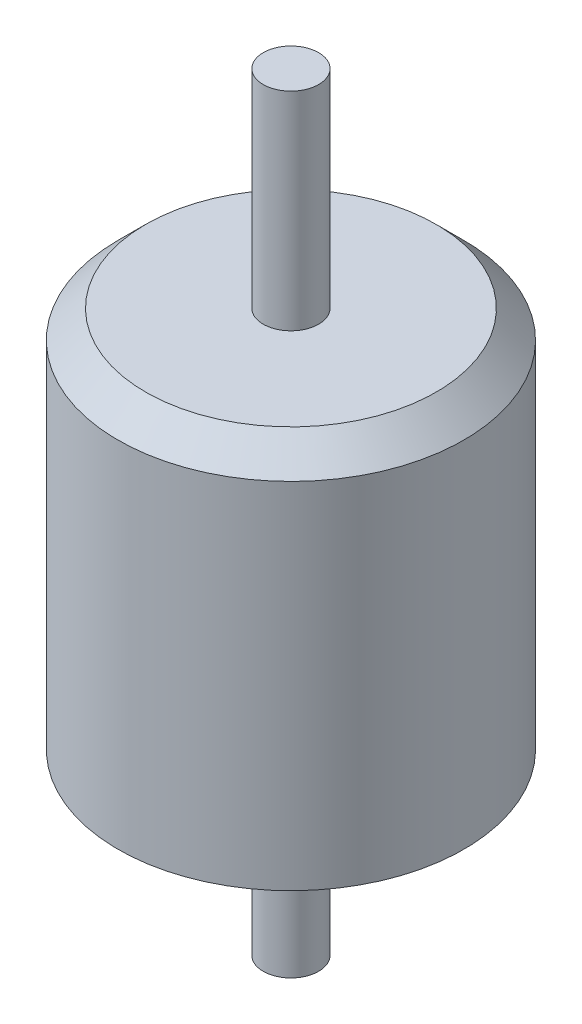
ISO-10303-21;
HEADER;
FILE_DESCRIPTION(('STEP AP214'),'2;1');
FILE_NAME('part.step','',(''),(''),'','','');
FILE_SCHEMA(('AUTOMOTIVE_DESIGN { 1 0 10303 214 1 1 1 1 }'));
ENDSEC;
DATA;
#1=APPLICATION_CONTEXT('core data for automotive mechanical design processes');
#2=APPLICATION_PROTOCOL_DEFINITION('international standard','automotive_design',2000,#1);
#3=PRODUCT_CONTEXT('',#1,'mechanical');
#4=PRODUCT('Part','Part','',(#3));
#5=PRODUCT_RELATED_PRODUCT_CATEGORY('part','',(#4));
#6=PRODUCT_DEFINITION_FORMATION('','',#4);
#7=PRODUCT_DEFINITION_CONTEXT('part definition',#1,'design');
#8=PRODUCT_DEFINITION('design','',#6,#7);
#9=PRODUCT_DEFINITION_SHAPE('','',#8);
#10=(LENGTH_UNIT() NAMED_UNIT(*) SI_UNIT(.MILLI.,.METRE.));
#11=(NAMED_UNIT(*) PLANE_ANGLE_UNIT() SI_UNIT($,.RADIAN.));
#12=(NAMED_UNIT(*) SI_UNIT($,.STERADIAN.) SOLID_ANGLE_UNIT());
#13=UNCERTAINTY_MEASURE_WITH_UNIT(LENGTH_MEASURE(1.E-05),#10,'distance_accuracy_value','');
#14=(GEOMETRIC_REPRESENTATION_CONTEXT(3) GLOBAL_UNCERTAINTY_ASSIGNED_CONTEXT((#13)) GLOBAL_UNIT_ASSIGNED_CONTEXT((#10,
#11,#12)) REPRESENTATION_CONTEXT('',''));
#15=CARTESIAN_POINT('',(0.,0.,0.));
#16=DIRECTION('',(0.,0.,1.));
#17=DIRECTION('',(1.,0.,0.));
#18=AXIS2_PLACEMENT_3D('',#15,#16,#17);
#19=CARTESIAN_POINT('',(0.,0.,0.));
#20=DIRECTION('',(0.,1.,0.));
#21=DIRECTION('',(-1.,0.,0.));
#22=AXIS2_PLACEMENT_3D('',#19,#20,#21);
#23=PLANE('',#22);
#24=CARTESIAN_POINT('',(0.,0.,0.));
#25=DIRECTION('',(0.,1.,0.));
#26=DIRECTION('',(-1.,0.,0.));
#27=AXIS2_PLACEMENT_3D('',#24,#25,#26);
#28=CIRCLE('',#27,4.00000000000001);
#29=CARTESIAN_POINT('',(-4.00000000000001,0.,0.));
#30=VERTEX_POINT('',#29);
#31=EDGE_CURVE('E10',#30,#30,#28,.T.);
#32=ORIENTED_EDGE('',*,*,#31,.F.);
#33=EDGE_LOOP('',(#32));
#34=FACE_BOUND('',#33,.T.);
#35=ADVANCED_FACE('F31',(#34),#23,.F.);
#36=CARTESIAN_POINT('',(0.,111.,0.));
#37=DIRECTION('',(0.,1.,0.));
#38=DIRECTION('',(-1.,0.,0.));
#39=AXIS2_PLACEMENT_3D('',#36,#37,#38);
#40=CYLINDRICAL_SURFACE('',#39,4.00000000000001);
#41=CARTESIAN_POINT('',(0.,16.,0.));
#42=DIRECTION('',(0.,1.,0.));
#43=DIRECTION('',(-1.,0.,0.));
#44=AXIS2_PLACEMENT_3D('',#41,#42,#43);
#45=CIRCLE('',#44,4.00000000000001);
#46=CARTESIAN_POINT('',(-4.00000000000001,16.,0.));
#47=VERTEX_POINT('',#46);
#48=EDGE_CURVE('E37',#47,#47,#45,.T.);
#49=ORIENTED_EDGE('',*,*,#48,.F.);
#50=EDGE_LOOP('',(#49));
#51=FACE_BOUND('',#50,.T.);
#52=ORIENTED_EDGE('',*,*,#31,.T.);
#53=EDGE_LOOP('',(#52));
#54=FACE_BOUND('',#53,.T.);
#55=ADVANCED_FACE('F115',(#51,#54),#40,.T.);
#56=CARTESIAN_POINT('',(4.00000000000001,16.,0.));
#57=DIRECTION('',(0.,1.,0.));
#58=DIRECTION('',(-1.,0.,0.));
#59=AXIS2_PLACEMENT_3D('',#56,#57,#58);
#60=PLANE('',#59);
#61=CARTESIAN_POINT('',(0.,16.,0.));
#62=DIRECTION('',(0.,1.,0.));
#63=DIRECTION('',(-1.,0.,0.));
#64=AXIS2_PLACEMENT_3D('',#61,#62,#63);
#65=CIRCLE('',#64,7.00000000000001);
#66=CARTESIAN_POINT('',(-7.00000000000001,16.,0.));
#67=VERTEX_POINT('',#66);
#68=EDGE_CURVE('E41',#67,#67,#65,.T.);
#69=ORIENTED_EDGE('',*,*,#68,.F.);
#70=EDGE_LOOP('',(#69));
#71=FACE_BOUND('',#70,.T.);
#72=ORIENTED_EDGE('',*,*,#48,.T.);
#73=EDGE_LOOP('',(#72));
#74=FACE_BOUND('',#73,.T.);
#75=ADVANCED_FACE('F110',(#71,#74),#60,.F.);
#76=CARTESIAN_POINT('',(0.,111.,0.));
#77=DIRECTION('',(0.,1.,0.));
#78=DIRECTION('',(-1.,0.,0.));
#79=AXIS2_PLACEMENT_3D('',#76,#77,#78);
#80=CYLINDRICAL_SURFACE('',#79,7.00000000000001);
#81=CARTESIAN_POINT('',(0.,20.,0.));
#82=DIRECTION('',(0.,1.,0.));
#83=DIRECTION('',(-1.,0.,0.));
#84=AXIS2_PLACEMENT_3D('',#81,#82,#83);
#85=CIRCLE('',#84,7.00000000000001);
#86=CARTESIAN_POINT('',(-7.00000000000001,20.,0.));
#87=VERTEX_POINT('',#86);
#88=EDGE_CURVE('E45',#87,#87,#85,.T.);
#89=ORIENTED_EDGE('',*,*,#88,.F.);
#90=EDGE_LOOP('',(#89));
#91=FACE_BOUND('',#90,.T.);
#92=ORIENTED_EDGE('',*,*,#68,.T.);
#93=EDGE_LOOP('',(#92));
#94=FACE_BOUND('',#93,.T.);
#95=ADVANCED_FACE('F104',(#91,#94),#80,.T.);
#96=CARTESIAN_POINT('',(7.00000000000001,20.,0.));
#97=DIRECTION('',(0.,1.,0.));
#98=DIRECTION('',(-1.,0.,0.));
#99=AXIS2_PLACEMENT_3D('',#96,#97,#98);
#100=PLANE('',#99);
#101=CARTESIAN_POINT('',(0.,20.,0.));
#102=DIRECTION('',(0.,1.,0.));
#103=DIRECTION('',(-1.,0.,0.));
#104=AXIS2_PLACEMENT_3D('',#101,#102,#103);
#105=CIRCLE('',#104,15.);
#106=CARTESIAN_POINT('',(-15.,20.,0.));
#107=VERTEX_POINT('',#106);
#108=EDGE_CURVE('E50',#107,#107,#105,.T.);
#109=ORIENTED_EDGE('',*,*,#108,.F.);
#110=EDGE_LOOP('',(#109));
#111=FACE_BOUND('',#110,.T.);
#112=ORIENTED_EDGE('',*,*,#88,.T.);
#113=EDGE_LOOP('',(#112));
#114=FACE_BOUND('',#113,.T.);
#115=ADVANCED_FACE('F98',(#111,#114),#100,.F.);
#116=CARTESIAN_POINT('',(0.,20.,0.));
#117=DIRECTION('',(0.,1.,0.));
#118=DIRECTION('',(-1.,0.,0.));
#119=AXIS2_PLACEMENT_3D('',#116,#117,#118);
#120=CONICAL_SURFACE('',#119,15.,1.0471975511966);
#121=CARTESIAN_POINT('',(0.,25.7735026918963,0.));
#122=DIRECTION('',(0.,1.,0.));
#123=DIRECTION('',(-1.,0.,0.));
#124=AXIS2_PLACEMENT_3D('',#121,#122,#123);
#125=CIRCLE('',#124,25.);
#126=CARTESIAN_POINT('',(-25.,25.7735026918963,0.));
#127=VERTEX_POINT('',#126);
#128=EDGE_CURVE('E53',#127,#127,#125,.T.);
#129=ORIENTED_EDGE('',*,*,#128,.F.);
#130=EDGE_LOOP('',(#129));
#131=FACE_BOUND('',#130,.T.);
#132=ORIENTED_EDGE('',*,*,#108,.T.);
#133=EDGE_LOOP('',(#132));
#134=FACE_BOUND('',#133,.T.);
#135=ADVANCED_FACE('F92',(#131,#134),#120,.T.);
#136=CARTESIAN_POINT('',(0.,111.,0.));
#137=DIRECTION('',(0.,1.,0.));
#138=DIRECTION('',(-1.,0.,0.));
#139=AXIS2_PLACEMENT_3D('',#136,#137,#138);
#140=CYLINDRICAL_SURFACE('',#139,25.);
#141=CARTESIAN_POINT('',(0.,77.,0.));
#142=DIRECTION('',(0.,1.,0.));
#143=DIRECTION('',(-1.,0.,0.));
#144=AXIS2_PLACEMENT_3D('',#141,#142,#143);
#145=CIRCLE('',#144,25.);
#146=CARTESIAN_POINT('',(-25.,77.,0.));
#147=VERTEX_POINT('',#146);
#148=EDGE_CURVE('E56',#147,#147,#145,.T.);
#149=ORIENTED_EDGE('',*,*,#148,.F.);
#150=EDGE_LOOP('',(#149));
#151=FACE_BOUND('',#150,.T.);
#152=ORIENTED_EDGE('',*,*,#128,.T.);
#153=EDGE_LOOP('',(#152));
#154=FACE_BOUND('',#153,.T.);
#155=ADVANCED_FACE('F86',(#151,#154),#140,.T.);
#156=CARTESIAN_POINT('',(0.,77.,0.));
#157=DIRECTION('',(0.,-1.,0.));
#158=DIRECTION('',(1.,0.,0.));
#159=AXIS2_PLACEMENT_3D('',#156,#157,#158);
#160=CONICAL_SURFACE('',#159,25.,0.785398163397447);
#161=CARTESIAN_POINT('',(0.,81.,0.));
#162=DIRECTION('',(0.,1.,0.));
#163=DIRECTION('',(-1.,0.,0.));
#164=AXIS2_PLACEMENT_3D('',#161,#162,#163);
#165=CIRCLE('',#164,21.);
#166=CARTESIAN_POINT('',(-21.,81.,0.));
#167=VERTEX_POINT('',#166);
#168=EDGE_CURVE('E59',#167,#167,#165,.T.);
#169=ORIENTED_EDGE('',*,*,#168,.F.);
#170=EDGE_LOOP('',(#169));
#171=FACE_BOUND('',#170,.T.);
#172=ORIENTED_EDGE('',*,*,#148,.T.);
#173=EDGE_LOOP('',(#172));
#174=FACE_BOUND('',#173,.T.);
#175=ADVANCED_FACE('F80',(#171,#174),#160,.T.);
#176=CARTESIAN_POINT('',(21.,81.,0.));
#177=DIRECTION('',(0.,-1.,0.));
#178=DIRECTION('',(1.,0.,0.));
#179=AXIS2_PLACEMENT_3D('',#176,#177,#178);
#180=PLANE('',#179);
#181=CARTESIAN_POINT('',(0.,81.,0.));
#182=DIRECTION('',(0.,1.,0.));
#183=DIRECTION('',(-1.,0.,0.));
#184=AXIS2_PLACEMENT_3D('',#181,#182,#183);
#185=CIRCLE('',#184,4.);
#186=CARTESIAN_POINT('',(-4.00000000000001,81.,0.));
#187=VERTEX_POINT('',#186);
#188=EDGE_CURVE('E62',#187,#187,#185,.T.);
#189=ORIENTED_EDGE('',*,*,#188,.F.);
#190=EDGE_LOOP('',(#189));
#191=FACE_BOUND('',#190,.T.);
#192=ORIENTED_EDGE('',*,*,#168,.T.);
#193=EDGE_LOOP('',(#192));
#194=FACE_BOUND('',#193,.T.);
#195=ADVANCED_FACE('F74',(#191,#194),#180,.F.);
#196=CARTESIAN_POINT('',(0.,111.,0.));
#197=DIRECTION('',(0.,1.,0.));
#198=DIRECTION('',(-1.,0.,0.));
#199=AXIS2_PLACEMENT_3D('',#196,#197,#198);
#200=CYLINDRICAL_SURFACE('',#199,4.00000000000001);
#201=CARTESIAN_POINT('',(0.,111.,0.));
#202=DIRECTION('',(0.,1.,0.));
#203=DIRECTION('',(-1.,0.,0.));
#204=AXIS2_PLACEMENT_3D('',#201,#202,#203);
#205=CIRCLE('',#204,4.00000000000001);
#206=CARTESIAN_POINT('',(-4.00000000000001,111.,0.));
#207=VERTEX_POINT('',#206);
#208=EDGE_CURVE('E65',#207,#207,#205,.T.);
#209=ORIENTED_EDGE('',*,*,#208,.F.);
#210=EDGE_LOOP('',(#209));
#211=FACE_BOUND('',#210,.T.);
#212=ORIENTED_EDGE('',*,*,#188,.T.);
#213=EDGE_LOOP('',(#212));
#214=FACE_BOUND('',#213,.T.);
#215=ADVANCED_FACE('F71',(#211,#214),#200,.T.);
#216=CARTESIAN_POINT('',(4.,111.,0.));
#217=DIRECTION('',(0.,-1.,0.));
#218=DIRECTION('',(1.,0.,0.));
#219=AXIS2_PLACEMENT_3D('',#216,#217,#218);
#220=PLANE('',#219);
#221=ORIENTED_EDGE('',*,*,#208,.T.);
#222=EDGE_LOOP('',(#221));
#223=FACE_BOUND('',#222,.T.);
#224=ADVANCED_FACE('F69',(#223),#220,.F.);
#225=CLOSED_SHELL('',(#35,#55,#75,#95,#115,#135,#155,#175,#195,#215,#224));
#226=MANIFOLD_SOLID_BREP('B2',#225);
#227=ADVANCED_BREP_SHAPE_REPRESENTATION('',(#18,#226),#14);
#228=SHAPE_DEFINITION_REPRESENTATION(#9,#227);
ENDSEC;
END-ISO-10303-21;
